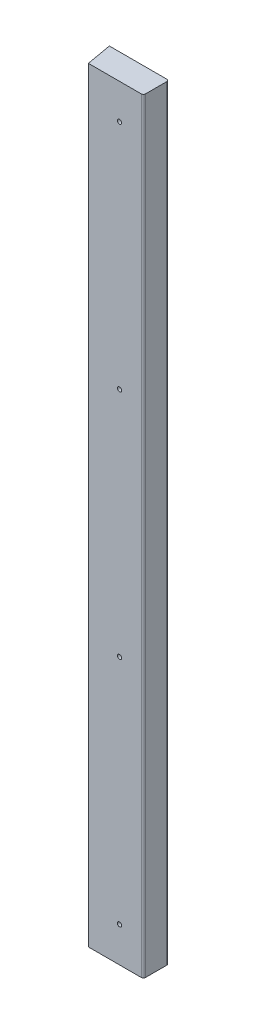
ISO-10303-21;
HEADER;
FILE_DESCRIPTION(('STEP AP214'),'2;1');
FILE_NAME('part.step','',(''),(''),'','','');
FILE_SCHEMA(('AUTOMOTIVE_DESIGN { 1 0 10303 214 1 1 1 1 }'));
ENDSEC;
DATA;
#1=APPLICATION_CONTEXT('core data for automotive mechanical design processes');
#2=APPLICATION_PROTOCOL_DEFINITION('international standard','automotive_design',2000,#1);
#3=PRODUCT_CONTEXT('',#1,'mechanical');
#4=PRODUCT('Part','Part','',(#3));
#5=PRODUCT_RELATED_PRODUCT_CATEGORY('part','',(#4));
#6=PRODUCT_DEFINITION_FORMATION('','',#4);
#7=PRODUCT_DEFINITION_CONTEXT('part definition',#1,'design');
#8=PRODUCT_DEFINITION('design','',#6,#7);
#9=PRODUCT_DEFINITION_SHAPE('','',#8);
#10=(LENGTH_UNIT() NAMED_UNIT(*) SI_UNIT(.MILLI.,.METRE.));
#11=(NAMED_UNIT(*) PLANE_ANGLE_UNIT() SI_UNIT($,.RADIAN.));
#12=(NAMED_UNIT(*) SI_UNIT($,.STERADIAN.) SOLID_ANGLE_UNIT());
#13=UNCERTAINTY_MEASURE_WITH_UNIT(LENGTH_MEASURE(1.E-05),#10,'distance_accuracy_value','');
#14=(GEOMETRIC_REPRESENTATION_CONTEXT(3) GLOBAL_UNCERTAINTY_ASSIGNED_CONTEXT((#13)) GLOBAL_UNIT_ASSIGNED_CONTEXT((#10,
#11,#12)) REPRESENTATION_CONTEXT('',''));
#15=CARTESIAN_POINT('',(0.,0.,0.));
#16=DIRECTION('',(0.,0.,1.));
#17=DIRECTION('',(1.,0.,0.));
#18=AXIS2_PLACEMENT_3D('',#15,#16,#17);
#19=CARTESIAN_POINT('',(44.4500000000001,1143.,-19.05));
#20=DIRECTION('',(-1.,0.,0.));
#21=DIRECTION('',(0.,0.,1.));
#22=AXIS2_PLACEMENT_3D('',#19,#20,#21);
#23=PLANE('',#22);
#24=DIRECTION('',(0.,0.,-1.));
#25=VECTOR('',#24,1.);
#26=CARTESIAN_POINT('',(44.4500000000001,1143.,-19.05));
#27=LINE('',#26,#25);
#28=CARTESIAN_POINT('',(44.4500000000001,1143.,15.875));
#29=VERTEX_POINT('',#28);
#30=CARTESIAN_POINT('',(44.450000000001,1143.,-15.875));
#31=VERTEX_POINT('',#30);
#32=EDGE_CURVE('E89',#29,#31,#27,.T.);
#33=ORIENTED_EDGE('',*,*,#32,.F.);
#34=DIRECTION('',(0.,-1.,0.));
#35=VECTOR('',#34,1.);
#36=CARTESIAN_POINT('',(44.4500000000001,1143.,15.8750000000001));
#37=LINE('',#36,#35);
#38=CARTESIAN_POINT('',(44.4500000000001,0.,15.8750000000004));
#39=VERTEX_POINT('',#38);
#40=EDGE_CURVE('E119',#29,#39,#37,.T.);
#41=ORIENTED_EDGE('',*,*,#40,.T.);
#42=DIRECTION('',(0.,0.,-1.));
#43=VECTOR('',#42,1.);
#44=CARTESIAN_POINT('',(44.4500000000001,0.,-19.0499999999996));
#45=LINE('',#44,#43);
#46=CARTESIAN_POINT('',(44.4500000000008,0.,-15.8749999999996));
#47=VERTEX_POINT('',#46);
#48=EDGE_CURVE('E108',#39,#47,#45,.T.);
#49=ORIENTED_EDGE('',*,*,#48,.T.);
#50=DIRECTION('',(0.,-1.,0.));
#51=VECTOR('',#50,1.);
#52=CARTESIAN_POINT('',(44.450000000001,1143.,-15.875));
#53=LINE('',#52,#51);
#54=EDGE_CURVE('E98',#47,#31,#53,.F.);
#55=ORIENTED_EDGE('',*,*,#54,.T.);
#56=EDGE_LOOP('',(#33,#41,#49,#55));
#57=FACE_BOUND('',#56,.T.);
#58=ADVANCED_FACE('F28',(#57),#23,.F.);
#59=CARTESIAN_POINT('',(44.4500000000001,1143.,-19.05));
#60=DIRECTION('',(0.,0.,1.));
#61=DIRECTION('',(1.,0.,0.));
#62=AXIS2_PLACEMENT_3D('',#59,#60,#61);
#63=PLANE('',#62);
#64=CARTESIAN_POINT('',(8.81744416499264,52.3875,-19.05));
#65=DIRECTION('',(0.,0.,1.));
#66=DIRECTION('',(1.,0.,0.));
#67=AXIS2_PLACEMENT_3D('',#64,#65,#66);
#68=CIRCLE('',#67,3.17499999999998);
#69=CARTESIAN_POINT('',(11.9924441649926,52.3875,-19.05));
#70=VERTEX_POINT('',#69);
#71=EDGE_CURVE('E246',#70,#70,#68,.T.);
#72=ORIENTED_EDGE('',*,*,#71,.T.);
#73=EDGE_LOOP('',(#72));
#74=FACE_BOUND('',#73,.T.);
#75=CARTESIAN_POINT('',(8.81744416499486,398.4625,-19.05));
#76=DIRECTION('',(0.,0.,1.));
#77=DIRECTION('',(1.,0.,0.));
#78=AXIS2_PLACEMENT_3D('',#75,#76,#77);
#79=CIRCLE('',#78,3.17499999999998);
#80=CARTESIAN_POINT('',(11.9924441649948,398.4625,-19.05));
#81=VERTEX_POINT('',#80);
#82=EDGE_CURVE('E240',#81,#81,#79,.T.);
#83=ORIENTED_EDGE('',*,*,#82,.T.);
#84=EDGE_LOOP('',(#83));
#85=FACE_BOUND('',#84,.T.);
#86=CARTESIAN_POINT('',(8.8174441649953,744.537500000001,-19.0499999999999));
#87=DIRECTION('',(0.,0.,1.));
#88=DIRECTION('',(1.,0.,0.));
#89=AXIS2_PLACEMENT_3D('',#86,#87,#88);
#90=CIRCLE('',#89,3.17499999999998);
#91=CARTESIAN_POINT('',(11.9924441649953,744.537500000001,-19.0499999999999));
#92=VERTEX_POINT('',#91);
#93=EDGE_CURVE('E231',#92,#92,#90,.T.);
#94=ORIENTED_EDGE('',*,*,#93,.T.);
#95=EDGE_LOOP('',(#94));
#96=FACE_BOUND('',#95,.T.);
#97=CARTESIAN_POINT('',(8.81744416499641,1090.6125,-19.05));
#98=DIRECTION('',(0.,0.,1.));
#99=DIRECTION('',(1.,0.,0.));
#100=AXIS2_PLACEMENT_3D('',#97,#98,#99);
#101=CIRCLE('',#100,3.17499999999998);
#102=CARTESIAN_POINT('',(11.9924441649964,1090.6125,-19.05));
#103=VERTEX_POINT('',#102);
#104=EDGE_CURVE('E111',#103,#103,#101,.T.);
#105=ORIENTED_EDGE('',*,*,#104,.T.);
#106=EDGE_LOOP('',(#105));
#107=FACE_BOUND('',#106,.T.);
#108=DIRECTION('',(-1.,0.,0.));
#109=VECTOR('',#108,1.);
#110=CARTESIAN_POINT('',(44.4500000000001,1143.,-19.05));
#111=LINE('',#110,#109);
#112=CARTESIAN_POINT('',(41.2749999999999,1143.,-19.05));
#113=VERTEX_POINT('',#112);
#114=CARTESIAN_POINT('',(-44.4499999999999,1143.,-19.05));
#115=VERTEX_POINT('',#114);
#116=EDGE_CURVE('E81',#113,#115,#111,.T.);
#117=ORIENTED_EDGE('',*,*,#116,.F.);
#118=DIRECTION('',(0.,-1.,0.));
#119=VECTOR('',#118,1.);
#120=CARTESIAN_POINT('',(41.2749999999999,1143.,-19.05));
#121=LINE('',#120,#119);
#122=CARTESIAN_POINT('',(41.2749999999999,0.,-19.05));
#123=VERTEX_POINT('',#122);
#124=EDGE_CURVE('E11',#113,#123,#121,.T.);
#125=ORIENTED_EDGE('',*,*,#124,.T.);
#126=DIRECTION('',(-1.,0.,0.));
#127=VECTOR('',#126,1.);
#128=CARTESIAN_POINT('',(44.4500000000001,0.,-19.0499999999996));
#129=LINE('',#128,#127);
#130=CARTESIAN_POINT('',(-44.4500000000001,0.,-19.05));
#131=VERTEX_POINT('',#130);
#132=EDGE_CURVE('E95',#123,#131,#129,.T.);
#133=ORIENTED_EDGE('',*,*,#132,.T.);
#134=DIRECTION('',(0.,-1.,0.));
#135=VECTOR('',#134,1.);
#136=CARTESIAN_POINT('',(-44.4499999999999,1143.,-19.05));
#137=LINE('',#136,#135);
#138=EDGE_CURVE('E92',#115,#131,#137,.T.);
#139=ORIENTED_EDGE('',*,*,#138,.F.);
#140=EDGE_LOOP('',(#117,#125,#133,#139));
#141=FACE_BOUND('',#140,.T.);
#142=ADVANCED_FACE('F93',(#74,#85,#96,#107,#141),#63,.F.);
#143=CARTESIAN_POINT('',(-44.4499999999999,1143.,-19.05));
#144=DIRECTION('',(0.984807753012207,0.,-0.173648177666935));
#145=DIRECTION('',(-0.173648177666935,0.,-0.984807753012207));
#146=AXIS2_PLACEMENT_3D('',#143,#144,#145);
#147=PLANE('',#146);
#148=DIRECTION('',(0.173648177666935,0.,0.984807753012207));
#149=VECTOR('',#148,1.);
#150=CARTESIAN_POINT('',(-44.4500000000001,0.,-19.05));
#151=LINE('',#150,#149);
#152=CARTESIAN_POINT('',(-37.7319420350073,0.,19.05));
#153=VERTEX_POINT('',#152);
#154=EDGE_CURVE('E113',#131,#153,#151,.T.);
#155=ORIENTED_EDGE('',*,*,#154,.T.);
#156=DIRECTION('',(0.,-1.,0.));
#157=VECTOR('',#156,1.);
#158=CARTESIAN_POINT('',(-37.7319420350073,1143.,19.05));
#159=LINE('',#158,#157);
#160=CARTESIAN_POINT('',(-37.7319420350073,1143.,19.05));
#161=VERTEX_POINT('',#160);
#162=EDGE_CURVE('E99',#161,#153,#159,.T.);
#163=ORIENTED_EDGE('',*,*,#162,.F.);
#164=DIRECTION('',(0.173648177666935,0.,0.984807753012207));
#165=VECTOR('',#164,1.);
#166=CARTESIAN_POINT('',(-44.4499999999999,1143.,-19.05));
#167=LINE('',#166,#165);
#168=EDGE_CURVE('E85',#115,#161,#167,.T.);
#169=ORIENTED_EDGE('',*,*,#168,.F.);
#170=ORIENTED_EDGE('',*,*,#138,.T.);
#171=EDGE_LOOP('',(#155,#163,#169,#170));
#172=FACE_BOUND('',#171,.T.);
#173=ADVANCED_FACE('F101',(#172),#147,.F.);
#174=CARTESIAN_POINT('',(44.4500000000001,1143.,19.05));
#175=DIRECTION('',(0.,0.,-1.));
#176=DIRECTION('',(-1.,0.,0.));
#177=AXIS2_PLACEMENT_3D('',#174,#175,#176);
#178=PLANE('',#177);
#179=CARTESIAN_POINT('',(8.81744416499264,52.3875,19.05));
#180=DIRECTION('',(0.,0.,1.));
#181=DIRECTION('',(1.,0.,0.));
#182=AXIS2_PLACEMENT_3D('',#179,#180,#181);
#183=CIRCLE('',#182,3.17499999999999);
#184=CARTESIAN_POINT('',(11.9924441649926,52.3875,19.05));
#185=VERTEX_POINT('',#184);
#186=EDGE_CURVE('E249',#185,#185,#183,.T.);
#187=ORIENTED_EDGE('',*,*,#186,.F.);
#188=EDGE_LOOP('',(#187));
#189=FACE_BOUND('',#188,.T.);
#190=CARTESIAN_POINT('',(8.81744416499486,398.4625,19.05));
#191=DIRECTION('',(0.,0.,1.));
#192=DIRECTION('',(1.,0.,0.));
#193=AXIS2_PLACEMENT_3D('',#190,#191,#192);
#194=CIRCLE('',#193,3.17499999999999);
#195=CARTESIAN_POINT('',(11.9924441649948,398.4625,19.05));
#196=VERTEX_POINT('',#195);
#197=EDGE_CURVE('E243',#196,#196,#194,.T.);
#198=ORIENTED_EDGE('',*,*,#197,.F.);
#199=EDGE_LOOP('',(#198));
#200=FACE_BOUND('',#199,.T.);
#201=CARTESIAN_POINT('',(8.8174441649953,744.537500000001,19.0500000000001));
#202=DIRECTION('',(0.,0.,1.));
#203=DIRECTION('',(1.,0.,0.));
#204=AXIS2_PLACEMENT_3D('',#201,#202,#203);
#205=CIRCLE('',#204,3.17499999999999);
#206=CARTESIAN_POINT('',(11.9924441649953,744.537500000001,19.0500000000001));
#207=VERTEX_POINT('',#206);
#208=EDGE_CURVE('E235',#207,#207,#205,.T.);
#209=ORIENTED_EDGE('',*,*,#208,.F.);
#210=EDGE_LOOP('',(#209));
#211=FACE_BOUND('',#210,.T.);
#212=CARTESIAN_POINT('',(8.81744416499641,1090.6125,19.05));
#213=DIRECTION('',(0.,0.,1.));
#214=DIRECTION('',(1.,0.,0.));
#215=AXIS2_PLACEMENT_3D('',#212,#213,#214);
#216=CIRCLE('',#215,3.17499999999999);
#217=CARTESIAN_POINT('',(11.9924441649964,1090.6125,19.05));
#218=VERTEX_POINT('',#217);
#219=EDGE_CURVE('E229',#218,#218,#216,.T.);
#220=ORIENTED_EDGE('',*,*,#219,.F.);
#221=EDGE_LOOP('',(#220));
#222=FACE_BOUND('',#221,.T.);
#223=DIRECTION('',(1.,0.,0.));
#224=VECTOR('',#223,1.);
#225=CARTESIAN_POINT('',(44.4500000000001,0.,19.0500000000005));
#226=LINE('',#225,#224);
#227=CARTESIAN_POINT('',(41.2749999999999,0.,19.05));
#228=VERTEX_POINT('',#227);
#229=EDGE_CURVE('E115',#153,#228,#226,.T.);
#230=ORIENTED_EDGE('',*,*,#229,.T.);
#231=DIRECTION('',(0.,-1.,0.));
#232=VECTOR('',#231,1.);
#233=CARTESIAN_POINT('',(41.2749999999999,1143.,19.05));
#234=LINE('',#233,#232);
#235=CARTESIAN_POINT('',(41.2749999999999,1143.,19.05));
#236=VERTEX_POINT('',#235);
#237=EDGE_CURVE('E51',#228,#236,#234,.F.);
#238=ORIENTED_EDGE('',*,*,#237,.T.);
#239=DIRECTION('',(1.,0.,0.));
#240=VECTOR('',#239,1.);
#241=CARTESIAN_POINT('',(44.4500000000001,1143.,19.05));
#242=LINE('',#241,#240);
#243=EDGE_CURVE('E103',#161,#236,#242,.T.);
#244=ORIENTED_EDGE('',*,*,#243,.F.);
#245=ORIENTED_EDGE('',*,*,#162,.T.);
#246=EDGE_LOOP('',(#230,#238,#244,#245));
#247=FACE_BOUND('',#246,.T.);
#248=ADVANCED_FACE('F138',(#189,#200,#211,#222,#247),#178,.F.);
#249=CARTESIAN_POINT('',(0.,1143.,0.));
#250=DIRECTION('',(0.,-1.,0.));
#251=DIRECTION('',(0.,0.,-1.));
#252=AXIS2_PLACEMENT_3D('',#249,#250,#251);
#253=PLANE('',#252);
#254=ORIENTED_EDGE('',*,*,#243,.T.);
#255=CARTESIAN_POINT('',(41.2750000000002,1143.,15.875));
#256=DIRECTION('',(0.,-1.,0.));
#257=DIRECTION('',(0.,0.,-1.));
#258=AXIS2_PLACEMENT_3D('',#255,#256,#257);
#259=CIRCLE('',#258,3.175);
#260=EDGE_CURVE('E36',#236,#29,#259,.F.);
#261=ORIENTED_EDGE('',*,*,#260,.T.);
#262=ORIENTED_EDGE('',*,*,#32,.T.);
#263=CARTESIAN_POINT('',(41.2750000000008,1143.,-15.875));
#264=DIRECTION('',(0.,-1.,0.));
#265=DIRECTION('',(0.,0.,-1.));
#266=AXIS2_PLACEMENT_3D('',#263,#264,#265);
#267=CIRCLE('',#266,3.175);
#268=EDGE_CURVE('E43',#31,#113,#267,.F.);
#269=ORIENTED_EDGE('',*,*,#268,.T.);
#270=ORIENTED_EDGE('',*,*,#116,.T.);
#271=ORIENTED_EDGE('',*,*,#168,.T.);
#272=EDGE_LOOP('',(#254,#261,#262,#269,#270,#271));
#273=FACE_BOUND('',#272,.T.);
#274=ADVANCED_FACE('F83',(#273),#253,.F.);
#275=CARTESIAN_POINT('',(0.,0.,0.));
#276=DIRECTION('',(0.,-1.,0.));
#277=DIRECTION('',(0.,0.,-1.));
#278=AXIS2_PLACEMENT_3D('',#275,#276,#277);
#279=PLANE('',#278);
#280=ORIENTED_EDGE('',*,*,#48,.F.);
#281=CARTESIAN_POINT('',(41.2749999999999,0.,15.8750000000001));
#282=DIRECTION('',(0.,-1.,0.));
#283=DIRECTION('',(0.,0.,-1.));
#284=AXIS2_PLACEMENT_3D('',#281,#282,#283);
#285=CIRCLE('',#284,3.175);
#286=EDGE_CURVE('E124',#39,#228,#285,.T.);
#287=ORIENTED_EDGE('',*,*,#286,.T.);
#288=ORIENTED_EDGE('',*,*,#229,.F.);
#289=ORIENTED_EDGE('',*,*,#154,.F.);
#290=ORIENTED_EDGE('',*,*,#132,.F.);
#291=CARTESIAN_POINT('',(41.2750000000008,0.,-15.875));
#292=DIRECTION('',(0.,-1.,0.));
#293=DIRECTION('',(0.,0.,-1.));
#294=AXIS2_PLACEMENT_3D('',#291,#292,#293);
#295=CIRCLE('',#294,3.175);
#296=EDGE_CURVE('E122',#123,#47,#295,.T.);
#297=ORIENTED_EDGE('',*,*,#296,.T.);
#298=EDGE_LOOP('',(#280,#287,#288,#289,#290,#297));
#299=FACE_BOUND('',#298,.T.);
#300=ADVANCED_FACE('F137',(#299),#279,.T.);
#301=CARTESIAN_POINT('',(8.81744416499641,1090.6125,19.05));
#302=DIRECTION('',(0.,0.,1.));
#303=DIRECTION('',(1.,0.,0.));
#304=AXIS2_PLACEMENT_3D('',#301,#302,#303);
#305=CYLINDRICAL_SURFACE('',#304,3.17499999999999);
#306=ORIENTED_EDGE('',*,*,#104,.F.);
#307=EDGE_LOOP('',(#306));
#308=FACE_BOUND('',#307,.T.);
#309=ORIENTED_EDGE('',*,*,#219,.T.);
#310=EDGE_LOOP('',(#309));
#311=FACE_BOUND('',#310,.T.);
#312=ADVANCED_FACE('F179',(#308,#311),#305,.F.);
#313=CARTESIAN_POINT('',(8.8174441649953,744.537500000001,19.0500000000001));
#314=DIRECTION('',(0.,0.,1.));
#315=DIRECTION('',(1.,0.,0.));
#316=AXIS2_PLACEMENT_3D('',#313,#314,#315);
#317=CYLINDRICAL_SURFACE('',#316,3.17499999999999);
#318=ORIENTED_EDGE('',*,*,#93,.F.);
#319=EDGE_LOOP('',(#318));
#320=FACE_BOUND('',#319,.T.);
#321=ORIENTED_EDGE('',*,*,#208,.T.);
#322=EDGE_LOOP('',(#321));
#323=FACE_BOUND('',#322,.T.);
#324=ADVANCED_FACE('F171',(#320,#323),#317,.F.);
#325=CARTESIAN_POINT('',(8.81744416499486,398.4625,19.05));
#326=DIRECTION('',(0.,0.,1.));
#327=DIRECTION('',(1.,0.,0.));
#328=AXIS2_PLACEMENT_3D('',#325,#326,#327);
#329=CYLINDRICAL_SURFACE('',#328,3.17499999999999);
#330=ORIENTED_EDGE('',*,*,#82,.F.);
#331=EDGE_LOOP('',(#330));
#332=FACE_BOUND('',#331,.T.);
#333=ORIENTED_EDGE('',*,*,#197,.T.);
#334=EDGE_LOOP('',(#333));
#335=FACE_BOUND('',#334,.T.);
#336=ADVANCED_FACE('F165',(#332,#335),#329,.F.);
#337=CARTESIAN_POINT('',(8.81744416499264,52.3875,19.05));
#338=DIRECTION('',(0.,0.,1.));
#339=DIRECTION('',(1.,0.,0.));
#340=AXIS2_PLACEMENT_3D('',#337,#338,#339);
#341=CYLINDRICAL_SURFACE('',#340,3.17499999999999);
#342=ORIENTED_EDGE('',*,*,#71,.F.);
#343=EDGE_LOOP('',(#342));
#344=FACE_BOUND('',#343,.T.);
#345=ORIENTED_EDGE('',*,*,#186,.T.);
#346=EDGE_LOOP('',(#345));
#347=FACE_BOUND('',#346,.T.);
#348=ADVANCED_FACE('F159',(#344,#347),#341,.F.);
#349=CARTESIAN_POINT('',(41.2750000000002,1143.,15.875));
#350=DIRECTION('',(0.,-1.,0.));
#351=DIRECTION('',(0.,0.,-1.));
#352=AXIS2_PLACEMENT_3D('',#349,#350,#351);
#353=CYLINDRICAL_SURFACE('',#352,3.175);
#354=ORIENTED_EDGE('',*,*,#260,.F.);
#355=ORIENTED_EDGE('',*,*,#237,.F.);
#356=ORIENTED_EDGE('',*,*,#286,.F.);
#357=ORIENTED_EDGE('',*,*,#40,.F.);
#358=EDGE_LOOP('',(#354,#355,#356,#357));
#359=FACE_BOUND('',#358,.T.);
#360=ADVANCED_FACE('F134',(#359),#353,.T.);
#361=CARTESIAN_POINT('',(41.2750000000008,1143.,-15.875));
#362=DIRECTION('',(0.,-1.,0.));
#363=DIRECTION('',(0.,0.,-1.));
#364=AXIS2_PLACEMENT_3D('',#361,#362,#363);
#365=CYLINDRICAL_SURFACE('',#364,3.175);
#366=ORIENTED_EDGE('',*,*,#268,.F.);
#367=ORIENTED_EDGE('',*,*,#54,.F.);
#368=ORIENTED_EDGE('',*,*,#296,.F.);
#369=ORIENTED_EDGE('',*,*,#124,.F.);
#370=EDGE_LOOP('',(#366,#367,#368,#369));
#371=FACE_BOUND('',#370,.T.);
#372=ADVANCED_FACE('F30',(#371),#365,.T.);
#373=CLOSED_SHELL('',(#58,#142,#173,#248,#274,#300,#312,#324,#336,#348,#360,#372));
#374=MANIFOLD_SOLID_BREP('B2',#373);
#375=ADVANCED_BREP_SHAPE_REPRESENTATION('',(#18,#374),#14);
#376=SHAPE_DEFINITION_REPRESENTATION(#9,#375);
ENDSEC;
END-ISO-10303-21;
